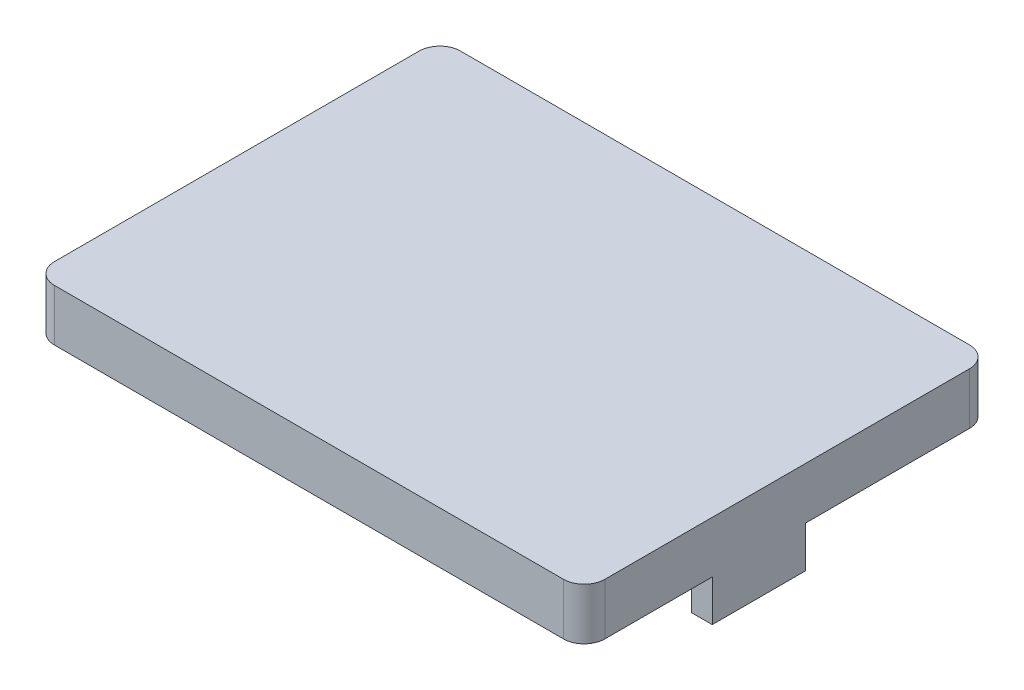
ISO-10303-21;
HEADER;
FILE_DESCRIPTION(('STEP AP214'),'2;1');
FILE_NAME('part.step','',(''),(''),'','','');
FILE_SCHEMA(('AUTOMOTIVE_DESIGN { 1 0 10303 214 1 1 1 1 }'));
ENDSEC;
DATA;
#1=APPLICATION_CONTEXT('core data for automotive mechanical design processes');
#2=APPLICATION_PROTOCOL_DEFINITION('international standard','automotive_design',2000,#1);
#3=PRODUCT_CONTEXT('',#1,'mechanical');
#4=PRODUCT('Part','Part','',(#3));
#5=PRODUCT_RELATED_PRODUCT_CATEGORY('part','',(#4));
#6=PRODUCT_DEFINITION_FORMATION('','',#4);
#7=PRODUCT_DEFINITION_CONTEXT('part definition',#1,'design');
#8=PRODUCT_DEFINITION('design','',#6,#7);
#9=PRODUCT_DEFINITION_SHAPE('','',#8);
#10=(LENGTH_UNIT() NAMED_UNIT(*) SI_UNIT(.MILLI.,.METRE.));
#11=(NAMED_UNIT(*) PLANE_ANGLE_UNIT() SI_UNIT($,.RADIAN.));
#12=(NAMED_UNIT(*) SI_UNIT($,.STERADIAN.) SOLID_ANGLE_UNIT());
#13=UNCERTAINTY_MEASURE_WITH_UNIT(LENGTH_MEASURE(1.E-05),#10,'distance_accuracy_value','');
#14=(GEOMETRIC_REPRESENTATION_CONTEXT(3) GLOBAL_UNCERTAINTY_ASSIGNED_CONTEXT((#13)) GLOBAL_UNIT_ASSIGNED_CONTEXT((#10,
#11,#12)) REPRESENTATION_CONTEXT('',''));
#15=CARTESIAN_POINT('',(0.,0.,0.));
#16=DIRECTION('',(0.,0.,1.));
#17=DIRECTION('',(1.,0.,0.));
#18=AXIS2_PLACEMENT_3D('',#15,#16,#17);
#19=CARTESIAN_POINT('',(0.,0.,0.));
#20=DIRECTION('',(0.,1.,0.));
#21=DIRECTION('',(0.,0.,1.));
#22=AXIS2_PLACEMENT_3D('',#19,#20,#21);
#23=PLANE('',#22);
#24=CARTESIAN_POINT('',(-23.03,0.,-16.045));
#25=DIRECTION('',(0.,-1.,0.));
#26=DIRECTION('',(0.,0.,-1.));
#27=AXIS2_PLACEMENT_3D('',#24,#25,#26);
#28=CIRCLE('',#27,2.55);
#29=CARTESIAN_POINT('',(-23.03,0.,-18.595));
#30=VERTEX_POINT('',#29);
#31=EDGE_CURVE('E146',#30,#30,#28,.T.);
#32=ORIENTED_EDGE('',*,*,#31,.F.);
#33=EDGE_LOOP('',(#32));
#34=FACE_BOUND('',#33,.T.);
#35=CARTESIAN_POINT('',(-23.03,0.,16.045));
#36=DIRECTION('',(0.,-1.,0.));
#37=DIRECTION('',(0.,0.,-1.));
#38=AXIS2_PLACEMENT_3D('',#35,#36,#37);
#39=CIRCLE('',#38,2.55);
#40=CARTESIAN_POINT('',(-23.03,0.,13.495));
#41=VERTEX_POINT('',#40);
#42=EDGE_CURVE('E158',#41,#41,#39,.T.);
#43=ORIENTED_EDGE('',*,*,#42,.F.);
#44=EDGE_LOOP('',(#43));
#45=FACE_BOUND('',#44,.T.);
#46=DIRECTION('',(1.,0.,0.));
#47=VECTOR('',#46,1.);
#48=CARTESIAN_POINT('',(26.63,0.,-1.75200000000002));
#49=LINE('',#48,#47);
#50=CARTESIAN_POINT('',(24.63,0.,-1.75200000000002));
#51=VERTEX_POINT('',#50);
#52=CARTESIAN_POINT('',(26.63,0.,-1.75200000000002));
#53=VERTEX_POINT('',#52);
#54=EDGE_CURVE('E48',#51,#53,#49,.T.);
#55=ORIENTED_EDGE('',*,*,#54,.F.);
#56=DIRECTION('',(0.,0.,-1.));
#57=VECTOR('',#56,1.);
#58=CARTESIAN_POINT('',(24.63,0.,-1.75200000000002));
#59=LINE('',#58,#57);
#60=CARTESIAN_POINT('',(24.63,0.,7.24799999999998));
#61=VERTEX_POINT('',#60);
#62=EDGE_CURVE('E416',#61,#51,#59,.T.);
#63=ORIENTED_EDGE('',*,*,#62,.F.);
#64=DIRECTION('',(-1.,0.,0.));
#65=VECTOR('',#64,1.);
#66=CARTESIAN_POINT('',(26.63,0.,7.24799999999998));
#67=LINE('',#66,#65);
#68=CARTESIAN_POINT('',(26.63,0.,7.24799999999998));
#69=VERTEX_POINT('',#68);
#70=EDGE_CURVE('E422',#69,#61,#67,.T.);
#71=ORIENTED_EDGE('',*,*,#70,.F.);
#72=DIRECTION('',(0.,0.,-1.));
#73=VECTOR('',#72,1.);
#74=CARTESIAN_POINT('',(26.63,0.,-19.645));
#75=LINE('',#74,#73);
#76=CARTESIAN_POINT('',(26.63,0.,17.645));
#77=VERTEX_POINT('',#76);
#78=EDGE_CURVE('E145',#77,#69,#75,.T.);
#79=ORIENTED_EDGE('',*,*,#78,.F.);
#80=CARTESIAN_POINT('',(24.63,0.,17.645));
#81=DIRECTION('',(0.,1.,0.));
#82=DIRECTION('',(0.,0.,1.));
#83=AXIS2_PLACEMENT_3D('',#80,#81,#82);
#84=CIRCLE('',#83,2.);
#85=CARTESIAN_POINT('',(24.63,0.,19.645));
#86=VERTEX_POINT('',#85);
#87=EDGE_CURVE('E194',#77,#86,#84,.F.);
#88=ORIENTED_EDGE('',*,*,#87,.T.);
#89=DIRECTION('',(1.,0.,0.));
#90=VECTOR('',#89,1.);
#91=CARTESIAN_POINT('',(-26.63,0.,19.645));
#92=LINE('',#91,#90);
#93=CARTESIAN_POINT('',(-24.63,0.,19.645));
#94=VERTEX_POINT('',#93);
#95=EDGE_CURVE('E167',#94,#86,#92,.T.);
#96=ORIENTED_EDGE('',*,*,#95,.F.);
#97=CARTESIAN_POINT('',(-24.63,0.,17.645));
#98=DIRECTION('',(0.,1.,0.));
#99=DIRECTION('',(0.,0.,1.));
#100=AXIS2_PLACEMENT_3D('',#97,#98,#99);
#101=CIRCLE('',#100,2.);
#102=CARTESIAN_POINT('',(-26.63,0.,17.645));
#103=VERTEX_POINT('',#102);
#104=EDGE_CURVE('E190',#94,#103,#101,.F.);
#105=ORIENTED_EDGE('',*,*,#104,.T.);
#106=DIRECTION('',(0.,0.,1.));
#107=VECTOR('',#106,1.);
#108=CARTESIAN_POINT('',(-26.63,0.,-19.645));
#109=LINE('',#108,#107);
#110=CARTESIAN_POINT('',(-26.63,0.,-17.645));
#111=VERTEX_POINT('',#110);
#112=EDGE_CURVE('E181',#111,#103,#109,.T.);
#113=ORIENTED_EDGE('',*,*,#112,.F.);
#114=CARTESIAN_POINT('',(-24.63,0.,-17.645));
#115=DIRECTION('',(0.,1.,0.));
#116=DIRECTION('',(0.,0.,1.));
#117=AXIS2_PLACEMENT_3D('',#114,#115,#116);
#118=CIRCLE('',#117,2.);
#119=CARTESIAN_POINT('',(-24.63,0.,-19.645));
#120=VERTEX_POINT('',#119);
#121=EDGE_CURVE('E192',#111,#120,#118,.F.);
#122=ORIENTED_EDGE('',*,*,#121,.T.);
#123=DIRECTION('',(-1.,0.,0.));
#124=VECTOR('',#123,1.);
#125=CARTESIAN_POINT('',(-26.63,0.,-19.645));
#126=LINE('',#125,#124);
#127=CARTESIAN_POINT('',(24.63,0.,-19.645));
#128=VERTEX_POINT('',#127);
#129=EDGE_CURVE('E178',#128,#120,#126,.T.);
#130=ORIENTED_EDGE('',*,*,#129,.F.);
#131=CARTESIAN_POINT('',(24.63,0.,-17.645));
#132=DIRECTION('',(0.,1.,0.));
#133=DIRECTION('',(0.,0.,1.));
#134=AXIS2_PLACEMENT_3D('',#131,#132,#133);
#135=CIRCLE('',#134,2.);
#136=CARTESIAN_POINT('',(26.63,0.,-17.645));
#137=VERTEX_POINT('',#136);
#138=EDGE_CURVE('E196',#128,#137,#135,.F.);
#139=ORIENTED_EDGE('',*,*,#138,.T.);
#140=EDGE_CURVE('E53',#53,#137,#75,.T.);
#141=ORIENTED_EDGE('',*,*,#140,.F.);
#142=EDGE_LOOP('',(#55,#63,#71,#79,#88,#96,#105,#113,#122,#130,#139,#141));
#143=FACE_BOUND('',#142,.T.);
#144=ADVANCED_FACE('F33',(#34,#45,#143),#23,.F.);
#145=CARTESIAN_POINT('',(26.63,5.,-19.645));
#146=DIRECTION('',(-1.,0.,0.));
#147=DIRECTION('',(0.,0.,1.));
#148=AXIS2_PLACEMENT_3D('',#145,#146,#147);
#149=PLANE('',#148);
#150=ORIENTED_EDGE('',*,*,#78,.T.);
#151=DIRECTION('',(0.,1.,0.));
#152=VECTOR('',#151,1.);
#153=CARTESIAN_POINT('',(26.63,-4.,7.24799999999998));
#154=LINE('',#153,#152);
#155=CARTESIAN_POINT('',(26.63,-4.,7.24799999999998));
#156=VERTEX_POINT('',#155);
#157=EDGE_CURVE('E125',#156,#69,#154,.T.);
#158=ORIENTED_EDGE('',*,*,#157,.F.);
#159=DIRECTION('',(0.,0.,1.));
#160=VECTOR('',#159,1.);
#161=CARTESIAN_POINT('',(26.63,-4.,-1.75200000000002));
#162=LINE('',#161,#160);
#163=CARTESIAN_POINT('',(26.63,-4.,-1.75200000000002));
#164=VERTEX_POINT('',#163);
#165=EDGE_CURVE('E131',#164,#156,#162,.T.);
#166=ORIENTED_EDGE('',*,*,#165,.F.);
#167=DIRECTION('',(0.,1.,0.));
#168=VECTOR('',#167,1.);
#169=CARTESIAN_POINT('',(26.63,-4.,-1.75200000000002));
#170=LINE('',#169,#168);
#171=EDGE_CURVE('E414',#164,#53,#170,.T.);
#172=ORIENTED_EDGE('',*,*,#171,.T.);
#173=ORIENTED_EDGE('',*,*,#140,.T.);
#174=DIRECTION('',(0.,-1.,0.));
#175=VECTOR('',#174,1.);
#176=CARTESIAN_POINT('',(26.63,5.,-17.645));
#177=LINE('',#176,#175);
#178=CARTESIAN_POINT('',(26.63,5.,-17.645));
#179=VERTEX_POINT('',#178);
#180=EDGE_CURVE('E200',#137,#179,#177,.F.);
#181=ORIENTED_EDGE('',*,*,#180,.T.);
#182=DIRECTION('',(0.,0.,-1.));
#183=VECTOR('',#182,1.);
#184=CARTESIAN_POINT('',(26.63,5.,-19.645));
#185=LINE('',#184,#183);
#186=CARTESIAN_POINT('',(26.63,5.,17.645));
#187=VERTEX_POINT('',#186);
#188=EDGE_CURVE('E163',#187,#179,#185,.T.);
#189=ORIENTED_EDGE('',*,*,#188,.F.);
#190=DIRECTION('',(0.,-1.,0.));
#191=VECTOR('',#190,1.);
#192=CARTESIAN_POINT('',(26.63,5.,17.645));
#193=LINE('',#192,#191);
#194=EDGE_CURVE('E198',#187,#77,#193,.T.);
#195=ORIENTED_EDGE('',*,*,#194,.T.);
#196=EDGE_LOOP('',(#150,#158,#166,#172,#173,#181,#189,#195));
#197=FACE_BOUND('',#196,.T.);
#198=ADVANCED_FACE('F142',(#197),#149,.F.);
#199=CARTESIAN_POINT('',(-26.63,5.,-19.645));
#200=DIRECTION('',(0.,0.,1.));
#201=DIRECTION('',(1.,0.,0.));
#202=AXIS2_PLACEMENT_3D('',#199,#200,#201);
#203=PLANE('',#202);
#204=DIRECTION('',(-1.,0.,0.));
#205=VECTOR('',#204,1.);
#206=CARTESIAN_POINT('',(-26.63,5.,-19.645));
#207=LINE('',#206,#205);
#208=CARTESIAN_POINT('',(24.63,5.,-19.645));
#209=VERTEX_POINT('',#208);
#210=CARTESIAN_POINT('',(-24.63,5.,-19.645));
#211=VERTEX_POINT('',#210);
#212=EDGE_CURVE('E166',#209,#211,#207,.T.);
#213=ORIENTED_EDGE('',*,*,#212,.F.);
#214=DIRECTION('',(0.,-1.,0.));
#215=VECTOR('',#214,1.);
#216=CARTESIAN_POINT('',(24.63,5.,-19.645));
#217=LINE('',#216,#215);
#218=EDGE_CURVE('E187',#209,#128,#217,.T.);
#219=ORIENTED_EDGE('',*,*,#218,.T.);
#220=ORIENTED_EDGE('',*,*,#129,.T.);
#221=DIRECTION('',(0.,-1.,0.));
#222=VECTOR('',#221,1.);
#223=CARTESIAN_POINT('',(-24.63,5.,-19.645));
#224=LINE('',#223,#222);
#225=EDGE_CURVE('E176',#120,#211,#224,.F.);
#226=ORIENTED_EDGE('',*,*,#225,.T.);
#227=EDGE_LOOP('',(#213,#219,#220,#226));
#228=FACE_BOUND('',#227,.T.);
#229=ADVANCED_FACE('F244',(#228),#203,.F.);
#230=CARTESIAN_POINT('',(-26.63,5.,-19.645));
#231=DIRECTION('',(1.,0.,0.));
#232=DIRECTION('',(0.,0.,-1.));
#233=AXIS2_PLACEMENT_3D('',#230,#231,#232);
#234=PLANE('',#233);
#235=DIRECTION('',(0.,0.,1.));
#236=VECTOR('',#235,1.);
#237=CARTESIAN_POINT('',(-26.63,5.,-19.645));
#238=LINE('',#237,#236);
#239=CARTESIAN_POINT('',(-26.63,5.,-17.645));
#240=VERTEX_POINT('',#239);
#241=CARTESIAN_POINT('',(-26.63,5.,17.645));
#242=VERTEX_POINT('',#241);
#243=EDGE_CURVE('E170',#240,#242,#238,.T.);
#244=ORIENTED_EDGE('',*,*,#243,.F.);
#245=DIRECTION('',(0.,-1.,0.));
#246=VECTOR('',#245,1.);
#247=CARTESIAN_POINT('',(-26.63,5.,-17.645));
#248=LINE('',#247,#246);
#249=EDGE_CURVE('E11',#240,#111,#248,.T.);
#250=ORIENTED_EDGE('',*,*,#249,.T.);
#251=ORIENTED_EDGE('',*,*,#112,.T.);
#252=DIRECTION('',(0.,-1.,0.));
#253=VECTOR('',#252,1.);
#254=CARTESIAN_POINT('',(-26.63,5.,17.645));
#255=LINE('',#254,#253);
#256=EDGE_CURVE('E41',#103,#242,#255,.F.);
#257=ORIENTED_EDGE('',*,*,#256,.T.);
#258=EDGE_LOOP('',(#244,#250,#251,#257));
#259=FACE_BOUND('',#258,.T.);
#260=ADVANCED_FACE('F217',(#259),#234,.F.);
#261=CARTESIAN_POINT('',(-26.63,5.,19.645));
#262=DIRECTION('',(0.,0.,-1.));
#263=DIRECTION('',(-1.,0.,0.));
#264=AXIS2_PLACEMENT_3D('',#261,#262,#263);
#265=PLANE('',#264);
#266=ORIENTED_EDGE('',*,*,#95,.T.);
#267=DIRECTION('',(0.,-1.,0.));
#268=VECTOR('',#267,1.);
#269=CARTESIAN_POINT('',(24.63,5.,19.645));
#270=LINE('',#269,#268);
#271=CARTESIAN_POINT('',(24.63,5.,19.645));
#272=VERTEX_POINT('',#271);
#273=EDGE_CURVE('E213',#86,#272,#270,.F.);
#274=ORIENTED_EDGE('',*,*,#273,.T.);
#275=DIRECTION('',(1.,0.,0.));
#276=VECTOR('',#275,1.);
#277=CARTESIAN_POINT('',(-26.63,5.,19.645));
#278=LINE('',#277,#276);
#279=CARTESIAN_POINT('',(-24.63,5.,19.645));
#280=VERTEX_POINT('',#279);
#281=EDGE_CURVE('E173',#280,#272,#278,.T.);
#282=ORIENTED_EDGE('',*,*,#281,.F.);
#283=DIRECTION('',(0.,-1.,0.));
#284=VECTOR('',#283,1.);
#285=CARTESIAN_POINT('',(-24.63,5.,19.645));
#286=LINE('',#285,#284);
#287=EDGE_CURVE('E210',#280,#94,#286,.T.);
#288=ORIENTED_EDGE('',*,*,#287,.T.);
#289=EDGE_LOOP('',(#266,#274,#282,#288));
#290=FACE_BOUND('',#289,.T.);
#291=ADVANCED_FACE('F229',(#290),#265,.F.);
#292=CARTESIAN_POINT('',(0.,5.,0.));
#293=DIRECTION('',(0.,1.,0.));
#294=DIRECTION('',(0.,0.,1.));
#295=AXIS2_PLACEMENT_3D('',#292,#293,#294);
#296=PLANE('',#295);
#297=ORIENTED_EDGE('',*,*,#188,.T.);
#298=CARTESIAN_POINT('',(24.63,5.,-17.645));
#299=DIRECTION('',(0.,1.,0.));
#300=DIRECTION('',(0.,0.,1.));
#301=AXIS2_PLACEMENT_3D('',#298,#299,#300);
#302=CIRCLE('',#301,2.);
#303=EDGE_CURVE('E208',#179,#209,#302,.T.);
#304=ORIENTED_EDGE('',*,*,#303,.T.);
#305=ORIENTED_EDGE('',*,*,#212,.T.);
#306=CARTESIAN_POINT('',(-24.63,5.,-17.645));
#307=DIRECTION('',(0.,1.,0.));
#308=DIRECTION('',(0.,0.,1.));
#309=AXIS2_PLACEMENT_3D('',#306,#307,#308);
#310=CIRCLE('',#309,2.);
#311=EDGE_CURVE('E204',#211,#240,#310,.T.);
#312=ORIENTED_EDGE('',*,*,#311,.T.);
#313=ORIENTED_EDGE('',*,*,#243,.T.);
#314=CARTESIAN_POINT('',(-24.63,5.,17.645));
#315=DIRECTION('',(0.,1.,0.));
#316=DIRECTION('',(0.,0.,1.));
#317=AXIS2_PLACEMENT_3D('',#314,#315,#316);
#318=CIRCLE('',#317,2.);
#319=EDGE_CURVE('E202',#242,#280,#318,.T.);
#320=ORIENTED_EDGE('',*,*,#319,.T.);
#321=ORIENTED_EDGE('',*,*,#281,.T.);
#322=CARTESIAN_POINT('',(24.63,5.,17.645));
#323=DIRECTION('',(0.,1.,0.));
#324=DIRECTION('',(0.,0.,1.));
#325=AXIS2_PLACEMENT_3D('',#322,#323,#324);
#326=CIRCLE('',#325,2.);
#327=EDGE_CURVE('E206',#272,#187,#326,.T.);
#328=ORIENTED_EDGE('',*,*,#327,.T.);
#329=EDGE_LOOP('',(#297,#304,#305,#312,#313,#320,#321,#328));
#330=FACE_BOUND('',#329,.T.);
#331=ADVANCED_FACE('F223',(#330),#296,.T.);
#332=CARTESIAN_POINT('',(24.63,5.,-17.645));
#333=DIRECTION('',(0.,-1.,0.));
#334=DIRECTION('',(0.,0.,-1.));
#335=AXIS2_PLACEMENT_3D('',#332,#333,#334);
#336=CYLINDRICAL_SURFACE('',#335,2.);
#337=ORIENTED_EDGE('',*,*,#303,.F.);
#338=ORIENTED_EDGE('',*,*,#180,.F.);
#339=ORIENTED_EDGE('',*,*,#138,.F.);
#340=ORIENTED_EDGE('',*,*,#218,.F.);
#341=EDGE_LOOP('',(#337,#338,#339,#340));
#342=FACE_BOUND('',#341,.T.);
#343=ADVANCED_FACE('F241',(#342),#336,.T.);
#344=CARTESIAN_POINT('',(24.63,5.,17.645));
#345=DIRECTION('',(0.,-1.,0.));
#346=DIRECTION('',(0.,0.,-1.));
#347=AXIS2_PLACEMENT_3D('',#344,#345,#346);
#348=CYLINDRICAL_SURFACE('',#347,2.);
#349=ORIENTED_EDGE('',*,*,#327,.F.);
#350=ORIENTED_EDGE('',*,*,#273,.F.);
#351=ORIENTED_EDGE('',*,*,#87,.F.);
#352=ORIENTED_EDGE('',*,*,#194,.F.);
#353=EDGE_LOOP('',(#349,#350,#351,#352));
#354=FACE_BOUND('',#353,.T.);
#355=ADVANCED_FACE('F234',(#354),#348,.T.);
#356=CARTESIAN_POINT('',(-24.63,5.,-17.645));
#357=DIRECTION('',(0.,-1.,0.));
#358=DIRECTION('',(0.,0.,-1.));
#359=AXIS2_PLACEMENT_3D('',#356,#357,#358);
#360=CYLINDRICAL_SURFACE('',#359,2.);
#361=ORIENTED_EDGE('',*,*,#311,.F.);
#362=ORIENTED_EDGE('',*,*,#225,.F.);
#363=ORIENTED_EDGE('',*,*,#121,.F.);
#364=ORIENTED_EDGE('',*,*,#249,.F.);
#365=EDGE_LOOP('',(#361,#362,#363,#364));
#366=FACE_BOUND('',#365,.T.);
#367=ADVANCED_FACE('F247',(#366),#360,.T.);
#368=CARTESIAN_POINT('',(-24.63,5.,17.645));
#369=DIRECTION('',(0.,-1.,0.));
#370=DIRECTION('',(0.,0.,-1.));
#371=AXIS2_PLACEMENT_3D('',#368,#369,#370);
#372=CYLINDRICAL_SURFACE('',#371,2.);
#373=ORIENTED_EDGE('',*,*,#319,.F.);
#374=ORIENTED_EDGE('',*,*,#256,.F.);
#375=ORIENTED_EDGE('',*,*,#104,.F.);
#376=ORIENTED_EDGE('',*,*,#287,.F.);
#377=EDGE_LOOP('',(#373,#374,#375,#376));
#378=FACE_BOUND('',#377,.T.);
#379=ADVANCED_FACE('F35',(#378),#372,.T.);
#380=CARTESIAN_POINT('',(-23.03,4.1,-16.045));
#381=DIRECTION('',(0.,-1.,0.));
#382=DIRECTION('',(0.,0.,-1.));
#383=AXIS2_PLACEMENT_3D('',#380,#381,#382);
#384=CYLINDRICAL_SURFACE('',#383,2.55);
#385=CARTESIAN_POINT('',(-23.03,4.1,-16.045));
#386=DIRECTION('',(0.,-1.,0.));
#387=DIRECTION('',(0.,0.,-1.));
#388=AXIS2_PLACEMENT_3D('',#385,#386,#387);
#389=CIRCLE('',#388,2.55);
#390=CARTESIAN_POINT('',(-23.03,4.1,-18.595));
#391=VERTEX_POINT('',#390);
#392=EDGE_CURVE('E149',#391,#391,#389,.T.);
#393=ORIENTED_EDGE('',*,*,#392,.F.);
#394=EDGE_LOOP('',(#393));
#395=FACE_BOUND('',#394,.T.);
#396=ORIENTED_EDGE('',*,*,#31,.T.);
#397=EDGE_LOOP('',(#396));
#398=FACE_BOUND('',#397,.T.);
#399=ADVANCED_FACE('F253',(#395,#398),#384,.F.);
#400=CARTESIAN_POINT('',(-23.03,4.1,-16.045));
#401=DIRECTION('',(0.,-1.,0.));
#402=DIRECTION('',(0.,0.,-1.));
#403=AXIS2_PLACEMENT_3D('',#400,#401,#402);
#404=PLANE('',#403);
#405=ORIENTED_EDGE('',*,*,#392,.T.);
#406=EDGE_LOOP('',(#405));
#407=FACE_BOUND('',#406,.T.);
#408=ADVANCED_FACE('F347',(#407),#404,.T.);
#409=CARTESIAN_POINT('',(-23.03,4.1,16.045));
#410=DIRECTION('',(0.,-1.,0.));
#411=DIRECTION('',(0.,0.,-1.));
#412=AXIS2_PLACEMENT_3D('',#409,#410,#411);
#413=CYLINDRICAL_SURFACE('',#412,2.55);
#414=CARTESIAN_POINT('',(-23.03,4.1,16.045));
#415=DIRECTION('',(0.,-1.,0.));
#416=DIRECTION('',(0.,0.,-1.));
#417=AXIS2_PLACEMENT_3D('',#414,#415,#416);
#418=CIRCLE('',#417,2.55);
#419=CARTESIAN_POINT('',(-23.03,4.1,13.495));
#420=VERTEX_POINT('',#419);
#421=EDGE_CURVE('E155',#420,#420,#418,.T.);
#422=ORIENTED_EDGE('',*,*,#421,.F.);
#423=EDGE_LOOP('',(#422));
#424=FACE_BOUND('',#423,.T.);
#425=ORIENTED_EDGE('',*,*,#42,.T.);
#426=EDGE_LOOP('',(#425));
#427=FACE_BOUND('',#426,.T.);
#428=ADVANCED_FACE('F343',(#424,#427),#413,.F.);
#429=CARTESIAN_POINT('',(-23.03,4.1,16.045));
#430=DIRECTION('',(0.,-1.,0.));
#431=DIRECTION('',(0.,0.,-1.));
#432=AXIS2_PLACEMENT_3D('',#429,#430,#431);
#433=PLANE('',#432);
#434=ORIENTED_EDGE('',*,*,#421,.T.);
#435=EDGE_LOOP('',(#434));
#436=FACE_BOUND('',#435,.T.);
#437=ADVANCED_FACE('F309',(#436),#433,.T.);
#438=CARTESIAN_POINT('',(26.63,-4.,7.24799999999998));
#439=DIRECTION('',(0.,0.,-1.));
#440=DIRECTION('',(-1.,0.,0.));
#441=AXIS2_PLACEMENT_3D('',#438,#439,#440);
#442=PLANE('',#441);
#443=ORIENTED_EDGE('',*,*,#70,.T.);
#444=DIRECTION('',(0.,1.,0.));
#445=VECTOR('',#444,1.);
#446=CARTESIAN_POINT('',(24.63,-4.,7.24799999999998));
#447=LINE('',#446,#445);
#448=CARTESIAN_POINT('',(24.63,-4.,7.24799999999998));
#449=VERTEX_POINT('',#448);
#450=EDGE_CURVE('E127',#449,#61,#447,.T.);
#451=ORIENTED_EDGE('',*,*,#450,.F.);
#452=DIRECTION('',(-1.,0.,0.));
#453=VECTOR('',#452,1.);
#454=CARTESIAN_POINT('',(26.63,-4.,7.24799999999998));
#455=LINE('',#454,#453);
#456=EDGE_CURVE('E120',#156,#449,#455,.T.);
#457=ORIENTED_EDGE('',*,*,#456,.F.);
#458=ORIENTED_EDGE('',*,*,#157,.T.);
#459=EDGE_LOOP('',(#443,#451,#457,#458));
#460=FACE_BOUND('',#459,.T.);
#461=ADVANCED_FACE('F123',(#460),#442,.F.);
#462=CARTESIAN_POINT('',(24.63,-4.,-1.75200000000002));
#463=DIRECTION('',(1.,0.,0.));
#464=DIRECTION('',(0.,0.,-1.));
#465=AXIS2_PLACEMENT_3D('',#462,#463,#464);
#466=PLANE('',#465);
#467=ORIENTED_EDGE('',*,*,#62,.T.);
#468=DIRECTION('',(0.,1.,0.));
#469=VECTOR('',#468,1.);
#470=CARTESIAN_POINT('',(24.63,-4.,-1.75200000000002));
#471=LINE('',#470,#469);
#472=CARTESIAN_POINT('',(24.63,-4.,-1.75200000000002));
#473=VERTEX_POINT('',#472);
#474=EDGE_CURVE('E151',#473,#51,#471,.T.);
#475=ORIENTED_EDGE('',*,*,#474,.F.);
#476=DIRECTION('',(0.,0.,-1.));
#477=VECTOR('',#476,1.);
#478=CARTESIAN_POINT('',(24.63,-4.,-1.75200000000002));
#479=LINE('',#478,#477);
#480=EDGE_CURVE('E130',#449,#473,#479,.T.);
#481=ORIENTED_EDGE('',*,*,#480,.F.);
#482=ORIENTED_EDGE('',*,*,#450,.T.);
#483=EDGE_LOOP('',(#467,#475,#481,#482));
#484=FACE_BOUND('',#483,.T.);
#485=ADVANCED_FACE('F308',(#484),#466,.F.);
#486=CARTESIAN_POINT('',(26.63,-4.,-1.75200000000002));
#487=DIRECTION('',(0.,0.,1.));
#488=DIRECTION('',(1.,0.,0.));
#489=AXIS2_PLACEMENT_3D('',#486,#487,#488);
#490=PLANE('',#489);
#491=ORIENTED_EDGE('',*,*,#54,.T.);
#492=ORIENTED_EDGE('',*,*,#171,.F.);
#493=DIRECTION('',(1.,0.,0.));
#494=VECTOR('',#493,1.);
#495=CARTESIAN_POINT('',(26.63,-4.,-1.75200000000002));
#496=LINE('',#495,#494);
#497=EDGE_CURVE('E136',#473,#164,#496,.T.);
#498=ORIENTED_EDGE('',*,*,#497,.F.);
#499=ORIENTED_EDGE('',*,*,#474,.T.);
#500=EDGE_LOOP('',(#491,#492,#498,#499));
#501=FACE_BOUND('',#500,.T.);
#502=ADVANCED_FACE('F319',(#501),#490,.F.);
#503=CARTESIAN_POINT('',(0.,-4.,0.));
#504=DIRECTION('',(0.,-1.,0.));
#505=DIRECTION('',(0.,0.,-1.));
#506=AXIS2_PLACEMENT_3D('',#503,#504,#505);
#507=PLANE('',#506);
#508=ORIENTED_EDGE('',*,*,#165,.T.);
#509=ORIENTED_EDGE('',*,*,#456,.T.);
#510=ORIENTED_EDGE('',*,*,#480,.T.);
#511=ORIENTED_EDGE('',*,*,#497,.T.);
#512=EDGE_LOOP('',(#508,#509,#510,#511));
#513=FACE_BOUND('',#512,.T.);
#514=ADVANCED_FACE('F134',(#513),#507,.T.);
#515=CLOSED_SHELL('',(#144,#198,#229,#260,#291,#331,#343,#355,#367,#379,#399,#408,#428,#437,
#461,#485,#502,#514));
#516=MANIFOLD_SOLID_BREP('B2',#515);
#517=ADVANCED_BREP_SHAPE_REPRESENTATION('',(#18,#516),#14);
#518=SHAPE_DEFINITION_REPRESENTATION(#9,#517);
ENDSEC;
END-ISO-10303-21;
